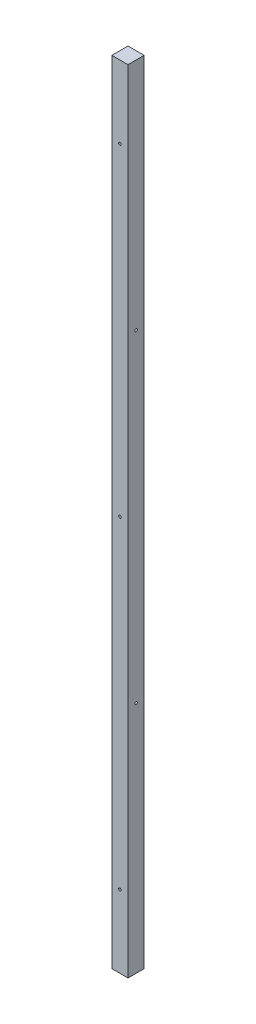
ISO-10303-21;
HEADER;
FILE_DESCRIPTION(('STEP AP214'),'2;1');
FILE_NAME('part.step','',(''),(''),'','','');
FILE_SCHEMA(('AUTOMOTIVE_DESIGN { 1 0 10303 214 1 1 1 1 }'));
ENDSEC;
DATA;
#1=APPLICATION_CONTEXT('core data for automotive mechanical design processes');
#2=APPLICATION_PROTOCOL_DEFINITION('international standard','automotive_design',2000,#1);
#3=PRODUCT_CONTEXT('',#1,'mechanical');
#4=PRODUCT('Part','Part','',(#3));
#5=PRODUCT_RELATED_PRODUCT_CATEGORY('part','',(#4));
#6=PRODUCT_DEFINITION_FORMATION('','',#4);
#7=PRODUCT_DEFINITION_CONTEXT('part definition',#1,'design');
#8=PRODUCT_DEFINITION('design','',#6,#7);
#9=PRODUCT_DEFINITION_SHAPE('','',#8);
#10=(LENGTH_UNIT() NAMED_UNIT(*) SI_UNIT(.MILLI.,.METRE.));
#11=(NAMED_UNIT(*) PLANE_ANGLE_UNIT() SI_UNIT($,.RADIAN.));
#12=(NAMED_UNIT(*) SI_UNIT($,.STERADIAN.) SOLID_ANGLE_UNIT());
#13=UNCERTAINTY_MEASURE_WITH_UNIT(LENGTH_MEASURE(1.E-05),#10,'distance_accuracy_value','');
#14=(GEOMETRIC_REPRESENTATION_CONTEXT(3) GLOBAL_UNCERTAINTY_ASSIGNED_CONTEXT((#13)) GLOBAL_UNIT_ASSIGNED_CONTEXT((#10,
#11,#12)) REPRESENTATION_CONTEXT('',''));
#15=CARTESIAN_POINT('',(0.,0.,0.));
#16=DIRECTION('',(0.,0.,1.));
#17=DIRECTION('',(1.,0.,0.));
#18=AXIS2_PLACEMENT_3D('',#15,#16,#17);
#19=CARTESIAN_POINT('',(-25.,2450.,-25.));
#20=DIRECTION('',(1.,0.,0.));
#21=DIRECTION('',(0.,0.,-1.));
#22=AXIS2_PLACEMENT_3D('',#19,#20,#21);
#23=PLANE('',#22);
#24=CARTESIAN_POINT('',(-25.,1725.,0.));
#25=DIRECTION('',(1.,0.,0.));
#26=DIRECTION('',(0.,0.,-1.));
#27=AXIS2_PLACEMENT_3D('',#24,#25,#26);
#28=CIRCLE('',#27,4.);
#29=CARTESIAN_POINT('',(-25.,1725.,-4.00000000000009));
#30=VERTEX_POINT('',#29);
#31=EDGE_CURVE('E147',#30,#30,#28,.T.);
#32=ORIENTED_EDGE('',*,*,#31,.T.);
#33=EDGE_LOOP('',(#32));
#34=FACE_BOUND('',#33,.T.);
#35=CARTESIAN_POINT('',(-25.,725.,0.));
#36=DIRECTION('',(1.,0.,0.));
#37=DIRECTION('',(0.,0.,-1.));
#38=AXIS2_PLACEMENT_3D('',#35,#36,#37);
#39=CIRCLE('',#38,4.);
#40=CARTESIAN_POINT('',(-25.,725.,-4.));
#41=VERTEX_POINT('',#40);
#42=EDGE_CURVE('E158',#41,#41,#39,.T.);
#43=ORIENTED_EDGE('',*,*,#42,.T.);
#44=EDGE_LOOP('',(#43));
#45=FACE_BOUND('',#44,.T.);
#46=DIRECTION('',(0.,0.,1.));
#47=VECTOR('',#46,1.);
#48=CARTESIAN_POINT('',(-25.,0.,-25.));
#49=LINE('',#48,#47);
#50=CARTESIAN_POINT('',(-25.,0.,-25.));
#51=VERTEX_POINT('',#50);
#52=CARTESIAN_POINT('',(-25.,0.,25.));
#53=VERTEX_POINT('',#52);
#54=EDGE_CURVE('E113',#51,#53,#49,.T.);
#55=ORIENTED_EDGE('',*,*,#54,.T.);
#56=DIRECTION('',(0.,-1.,0.));
#57=VECTOR('',#56,1.);
#58=CARTESIAN_POINT('',(-25.,2450.,25.));
#59=LINE('',#58,#57);
#60=CARTESIAN_POINT('',(-25.,2450.,25.));
#61=VERTEX_POINT('',#60);
#62=EDGE_CURVE('E11',#61,#53,#59,.T.);
#63=ORIENTED_EDGE('',*,*,#62,.F.);
#64=DIRECTION('',(0.,0.,1.));
#65=VECTOR('',#64,1.);
#66=CARTESIAN_POINT('',(-25.,2450.,-25.));
#67=LINE('',#66,#65);
#68=CARTESIAN_POINT('',(-25.,2450.,-25.));
#69=VERTEX_POINT('',#68);
#70=EDGE_CURVE('E97',#69,#61,#67,.T.);
#71=ORIENTED_EDGE('',*,*,#70,.F.);
#72=DIRECTION('',(0.,-1.,0.));
#73=VECTOR('',#72,1.);
#74=CARTESIAN_POINT('',(-25.,2450.,-25.));
#75=LINE('',#74,#73);
#76=EDGE_CURVE('E109',#69,#51,#75,.T.);
#77=ORIENTED_EDGE('',*,*,#76,.T.);
#78=EDGE_LOOP('',(#55,#63,#71,#77));
#79=FACE_BOUND('',#78,.T.);
#80=ADVANCED_FACE('F45',(#34,#45,#79),#23,.F.);
#81=CARTESIAN_POINT('',(25.,2450.,25.));
#82=DIRECTION('',(0.,0.,-1.));
#83=DIRECTION('',(-1.,0.,0.));
#84=AXIS2_PLACEMENT_3D('',#81,#82,#83);
#85=PLANE('',#84);
#86=CARTESIAN_POINT('',(0.,225.,25.));
#87=DIRECTION('',(0.,0.,-1.));
#88=DIRECTION('',(-1.,0.,0.));
#89=AXIS2_PLACEMENT_3D('',#86,#87,#88);
#90=CIRCLE('',#89,4.);
#91=CARTESIAN_POINT('',(-4.,225.,25.));
#92=VERTEX_POINT('',#91);
#93=EDGE_CURVE('E142',#92,#92,#90,.T.);
#94=ORIENTED_EDGE('',*,*,#93,.T.);
#95=EDGE_LOOP('',(#94));
#96=FACE_BOUND('',#95,.T.);
#97=CARTESIAN_POINT('',(0.,2225.,25.));
#98=DIRECTION('',(0.,0.,-1.));
#99=DIRECTION('',(-1.,0.,0.));
#100=AXIS2_PLACEMENT_3D('',#97,#98,#99);
#101=CIRCLE('',#100,4.);
#102=CARTESIAN_POINT('',(-4.00000000000003,2225.,25.));
#103=VERTEX_POINT('',#102);
#104=EDGE_CURVE('E151',#103,#103,#101,.T.);
#105=ORIENTED_EDGE('',*,*,#104,.T.);
#106=EDGE_LOOP('',(#105));
#107=FACE_BOUND('',#106,.T.);
#108=CARTESIAN_POINT('',(-1.50019232895551E-13,1225.,25.));
#109=DIRECTION('',(0.,0.,-1.));
#110=DIRECTION('',(-1.,0.,0.));
#111=AXIS2_PLACEMENT_3D('',#108,#109,#110);
#112=CIRCLE('',#111,4.);
#113=CARTESIAN_POINT('',(-4.00000000000015,1225.,25.));
#114=VERTEX_POINT('',#113);
#115=EDGE_CURVE('E117',#114,#114,#112,.T.);
#116=ORIENTED_EDGE('',*,*,#115,.T.);
#117=EDGE_LOOP('',(#116));
#118=FACE_BOUND('',#117,.T.);
#119=DIRECTION('',(1.,0.,0.));
#120=VECTOR('',#119,1.);
#121=CARTESIAN_POINT('',(25.,0.,25.));
#122=LINE('',#121,#120);
#123=CARTESIAN_POINT('',(25.,0.,25.));
#124=VERTEX_POINT('',#123);
#125=EDGE_CURVE('E102',#53,#124,#122,.T.);
#126=ORIENTED_EDGE('',*,*,#125,.T.);
#127=DIRECTION('',(0.,-1.,0.));
#128=VECTOR('',#127,1.);
#129=CARTESIAN_POINT('',(25.,2450.,25.));
#130=LINE('',#129,#128);
#131=CARTESIAN_POINT('',(25.,2450.,25.));
#132=VERTEX_POINT('',#131);
#133=EDGE_CURVE('E54',#132,#124,#130,.T.);
#134=ORIENTED_EDGE('',*,*,#133,.F.);
#135=DIRECTION('',(1.,0.,0.));
#136=VECTOR('',#135,1.);
#137=CARTESIAN_POINT('',(25.,2450.,25.));
#138=LINE('',#137,#136);
#139=EDGE_CURVE('E92',#61,#132,#138,.T.);
#140=ORIENTED_EDGE('',*,*,#139,.F.);
#141=ORIENTED_EDGE('',*,*,#62,.T.);
#142=EDGE_LOOP('',(#126,#134,#140,#141));
#143=FACE_BOUND('',#142,.T.);
#144=ADVANCED_FACE('F101',(#96,#107,#118,#143),#85,.F.);
#145=CARTESIAN_POINT('',(25.,2450.,-25.));
#146=DIRECTION('',(-1.,0.,0.));
#147=DIRECTION('',(0.,0.,1.));
#148=AXIS2_PLACEMENT_3D('',#145,#146,#147);
#149=PLANE('',#148);
#150=CARTESIAN_POINT('',(25.,1725.,0.));
#151=DIRECTION('',(1.,0.,0.));
#152=DIRECTION('',(0.,0.,-1.));
#153=AXIS2_PLACEMENT_3D('',#150,#151,#152);
#154=CIRCLE('',#153,4.);
#155=CARTESIAN_POINT('',(25.,1725.,-4.00000000000009));
#156=VERTEX_POINT('',#155);
#157=EDGE_CURVE('E166',#156,#156,#154,.T.);
#158=ORIENTED_EDGE('',*,*,#157,.F.);
#159=EDGE_LOOP('',(#158));
#160=FACE_BOUND('',#159,.T.);
#161=CARTESIAN_POINT('',(25.,725.,0.));
#162=DIRECTION('',(1.,0.,0.));
#163=DIRECTION('',(0.,0.,-1.));
#164=AXIS2_PLACEMENT_3D('',#161,#162,#163);
#165=CIRCLE('',#164,4.);
#166=CARTESIAN_POINT('',(25.,725.,-4.));
#167=VERTEX_POINT('',#166);
#168=EDGE_CURVE('E162',#167,#167,#165,.T.);
#169=ORIENTED_EDGE('',*,*,#168,.F.);
#170=EDGE_LOOP('',(#169));
#171=FACE_BOUND('',#170,.T.);
#172=DIRECTION('',(0.,0.,-1.));
#173=VECTOR('',#172,1.);
#174=CARTESIAN_POINT('',(25.,0.,-25.));
#175=LINE('',#174,#173);
#176=CARTESIAN_POINT('',(25.,0.,-25.));
#177=VERTEX_POINT('',#176);
#178=EDGE_CURVE('E79',#124,#177,#175,.T.);
#179=ORIENTED_EDGE('',*,*,#178,.T.);
#180=DIRECTION('',(0.,-1.,0.));
#181=VECTOR('',#180,1.);
#182=CARTESIAN_POINT('',(25.,2450.,-25.));
#183=LINE('',#182,#181);
#184=CARTESIAN_POINT('',(25.,2450.,-25.));
#185=VERTEX_POINT('',#184);
#186=EDGE_CURVE('E104',#185,#177,#183,.T.);
#187=ORIENTED_EDGE('',*,*,#186,.F.);
#188=DIRECTION('',(0.,0.,-1.));
#189=VECTOR('',#188,1.);
#190=CARTESIAN_POINT('',(25.,2450.,-25.));
#191=LINE('',#190,#189);
#192=EDGE_CURVE('E95',#132,#185,#191,.T.);
#193=ORIENTED_EDGE('',*,*,#192,.F.);
#194=ORIENTED_EDGE('',*,*,#133,.T.);
#195=EDGE_LOOP('',(#179,#187,#193,#194));
#196=FACE_BOUND('',#195,.T.);
#197=ADVANCED_FACE('F105',(#160,#171,#196),#149,.F.);
#198=CARTESIAN_POINT('',(25.,2450.,-25.));
#199=DIRECTION('',(0.,0.,1.));
#200=DIRECTION('',(1.,0.,0.));
#201=AXIS2_PLACEMENT_3D('',#198,#199,#200);
#202=PLANE('',#201);
#203=CARTESIAN_POINT('',(0.,225.,-25.));
#204=DIRECTION('',(0.,0.,-1.));
#205=DIRECTION('',(-1.,0.,0.));
#206=AXIS2_PLACEMENT_3D('',#203,#204,#205);
#207=CIRCLE('',#206,4.);
#208=CARTESIAN_POINT('',(-4.,225.,-25.));
#209=VERTEX_POINT('',#208);
#210=EDGE_CURVE('E146',#209,#209,#207,.T.);
#211=ORIENTED_EDGE('',*,*,#210,.F.);
#212=EDGE_LOOP('',(#211));
#213=FACE_BOUND('',#212,.T.);
#214=CARTESIAN_POINT('',(0.,2225.,-25.));
#215=DIRECTION('',(0.,0.,-1.));
#216=DIRECTION('',(-1.,0.,0.));
#217=AXIS2_PLACEMENT_3D('',#214,#215,#216);
#218=CIRCLE('',#217,4.);
#219=CARTESIAN_POINT('',(-4.00000000000003,2225.,-25.));
#220=VERTEX_POINT('',#219);
#221=EDGE_CURVE('E138',#220,#220,#218,.T.);
#222=ORIENTED_EDGE('',*,*,#221,.F.);
#223=EDGE_LOOP('',(#222));
#224=FACE_BOUND('',#223,.T.);
#225=CARTESIAN_POINT('',(-1.50019232895551E-13,1225.,-25.));
#226=DIRECTION('',(0.,0.,-1.));
#227=DIRECTION('',(-1.,0.,0.));
#228=AXIS2_PLACEMENT_3D('',#225,#226,#227);
#229=CIRCLE('',#228,4.);
#230=CARTESIAN_POINT('',(-4.00000000000015,1225.,-25.));
#231=VERTEX_POINT('',#230);
#232=EDGE_CURVE('E134',#231,#231,#229,.T.);
#233=ORIENTED_EDGE('',*,*,#232,.F.);
#234=EDGE_LOOP('',(#233));
#235=FACE_BOUND('',#234,.T.);
#236=DIRECTION('',(-1.,0.,0.));
#237=VECTOR('',#236,1.);
#238=CARTESIAN_POINT('',(25.,0.,-25.));
#239=LINE('',#238,#237);
#240=EDGE_CURVE('E85',#177,#51,#239,.T.);
#241=ORIENTED_EDGE('',*,*,#240,.T.);
#242=ORIENTED_EDGE('',*,*,#76,.F.);
#243=DIRECTION('',(-1.,0.,0.));
#244=VECTOR('',#243,1.);
#245=CARTESIAN_POINT('',(25.,2450.,-25.));
#246=LINE('',#245,#244);
#247=EDGE_CURVE('E62',#185,#69,#246,.T.);
#248=ORIENTED_EDGE('',*,*,#247,.F.);
#249=ORIENTED_EDGE('',*,*,#186,.T.);
#250=EDGE_LOOP('',(#241,#242,#248,#249));
#251=FACE_BOUND('',#250,.T.);
#252=ADVANCED_FACE('F127',(#213,#224,#235,#251),#202,.F.);
#253=CARTESIAN_POINT('',(0.,2450.,0.));
#254=DIRECTION('',(0.,-1.,0.));
#255=DIRECTION('',(0.,0.,-1.));
#256=AXIS2_PLACEMENT_3D('',#253,#254,#255);
#257=PLANE('',#256);
#258=ORIENTED_EDGE('',*,*,#70,.T.);
#259=ORIENTED_EDGE('',*,*,#139,.T.);
#260=ORIENTED_EDGE('',*,*,#192,.T.);
#261=ORIENTED_EDGE('',*,*,#247,.T.);
#262=EDGE_LOOP('',(#258,#259,#260,#261));
#263=FACE_BOUND('',#262,.T.);
#264=ADVANCED_FACE('F93',(#263),#257,.F.);
#265=CARTESIAN_POINT('',(0.,0.,0.));
#266=DIRECTION('',(0.,-1.,0.));
#267=DIRECTION('',(0.,0.,-1.));
#268=AXIS2_PLACEMENT_3D('',#265,#266,#267);
#269=PLANE('',#268);
#270=ORIENTED_EDGE('',*,*,#54,.F.);
#271=ORIENTED_EDGE('',*,*,#240,.F.);
#272=ORIENTED_EDGE('',*,*,#178,.F.);
#273=ORIENTED_EDGE('',*,*,#125,.F.);
#274=EDGE_LOOP('',(#270,#271,#272,#273));
#275=FACE_BOUND('',#274,.T.);
#276=ADVANCED_FACE('F130',(#275),#269,.T.);
#277=CARTESIAN_POINT('',(-1.50019232895551E-13,1225.,25.));
#278=DIRECTION('',(0.,0.,-1.));
#279=DIRECTION('',(-1.,0.,0.));
#280=AXIS2_PLACEMENT_3D('',#277,#278,#279);
#281=CYLINDRICAL_SURFACE('',#280,4.);
#282=ORIENTED_EDGE('',*,*,#115,.F.);
#283=EDGE_LOOP('',(#282));
#284=FACE_BOUND('',#283,.T.);
#285=ORIENTED_EDGE('',*,*,#232,.T.);
#286=EDGE_LOOP('',(#285));
#287=FACE_BOUND('',#286,.T.);
#288=ADVANCED_FACE('F214',(#284,#287),#281,.F.);
#289=CARTESIAN_POINT('',(0.,2225.,25.));
#290=DIRECTION('',(0.,0.,-1.));
#291=DIRECTION('',(-1.,0.,0.));
#292=AXIS2_PLACEMENT_3D('',#289,#290,#291);
#293=CYLINDRICAL_SURFACE('',#292,4.);
#294=ORIENTED_EDGE('',*,*,#104,.F.);
#295=EDGE_LOOP('',(#294));
#296=FACE_BOUND('',#295,.T.);
#297=ORIENTED_EDGE('',*,*,#221,.T.);
#298=EDGE_LOOP('',(#297));
#299=FACE_BOUND('',#298,.T.);
#300=ADVANCED_FACE('F195',(#296,#299),#293,.F.);
#301=CARTESIAN_POINT('',(0.,225.,25.));
#302=DIRECTION('',(0.,0.,-1.));
#303=DIRECTION('',(-1.,0.,0.));
#304=AXIS2_PLACEMENT_3D('',#301,#302,#303);
#305=CYLINDRICAL_SURFACE('',#304,4.);
#306=ORIENTED_EDGE('',*,*,#93,.F.);
#307=EDGE_LOOP('',(#306));
#308=FACE_BOUND('',#307,.T.);
#309=ORIENTED_EDGE('',*,*,#210,.T.);
#310=EDGE_LOOP('',(#309));
#311=FACE_BOUND('',#310,.T.);
#312=ADVANCED_FACE('F189',(#308,#311),#305,.F.);
#313=CARTESIAN_POINT('',(-25.,725.,0.));
#314=DIRECTION('',(1.,0.,0.));
#315=DIRECTION('',(0.,0.,-1.));
#316=AXIS2_PLACEMENT_3D('',#313,#314,#315);
#317=CYLINDRICAL_SURFACE('',#316,4.);
#318=ORIENTED_EDGE('',*,*,#42,.F.);
#319=EDGE_LOOP('',(#318));
#320=FACE_BOUND('',#319,.T.);
#321=ORIENTED_EDGE('',*,*,#168,.T.);
#322=EDGE_LOOP('',(#321));
#323=FACE_BOUND('',#322,.T.);
#324=ADVANCED_FACE('F179',(#320,#323),#317,.F.);
#325=CARTESIAN_POINT('',(-25.,1725.,0.));
#326=DIRECTION('',(1.,0.,0.));
#327=DIRECTION('',(0.,0.,-1.));
#328=AXIS2_PLACEMENT_3D('',#325,#326,#327);
#329=CYLINDRICAL_SURFACE('',#328,4.);
#330=ORIENTED_EDGE('',*,*,#31,.F.);
#331=EDGE_LOOP('',(#330));
#332=FACE_BOUND('',#331,.T.);
#333=ORIENTED_EDGE('',*,*,#157,.T.);
#334=EDGE_LOOP('',(#333));
#335=FACE_BOUND('',#334,.T.);
#336=ADVANCED_FACE('F176',(#332,#335),#329,.F.);
#337=CLOSED_SHELL('',(#80,#144,#197,#252,#264,#276,#288,#300,#312,#324,#336));
#338=MANIFOLD_SOLID_BREP('B2',#337);
#339=ADVANCED_BREP_SHAPE_REPRESENTATION('',(#18,#338),#14);
#340=SHAPE_DEFINITION_REPRESENTATION(#9,#339);
ENDSEC;
END-ISO-10303-21;
